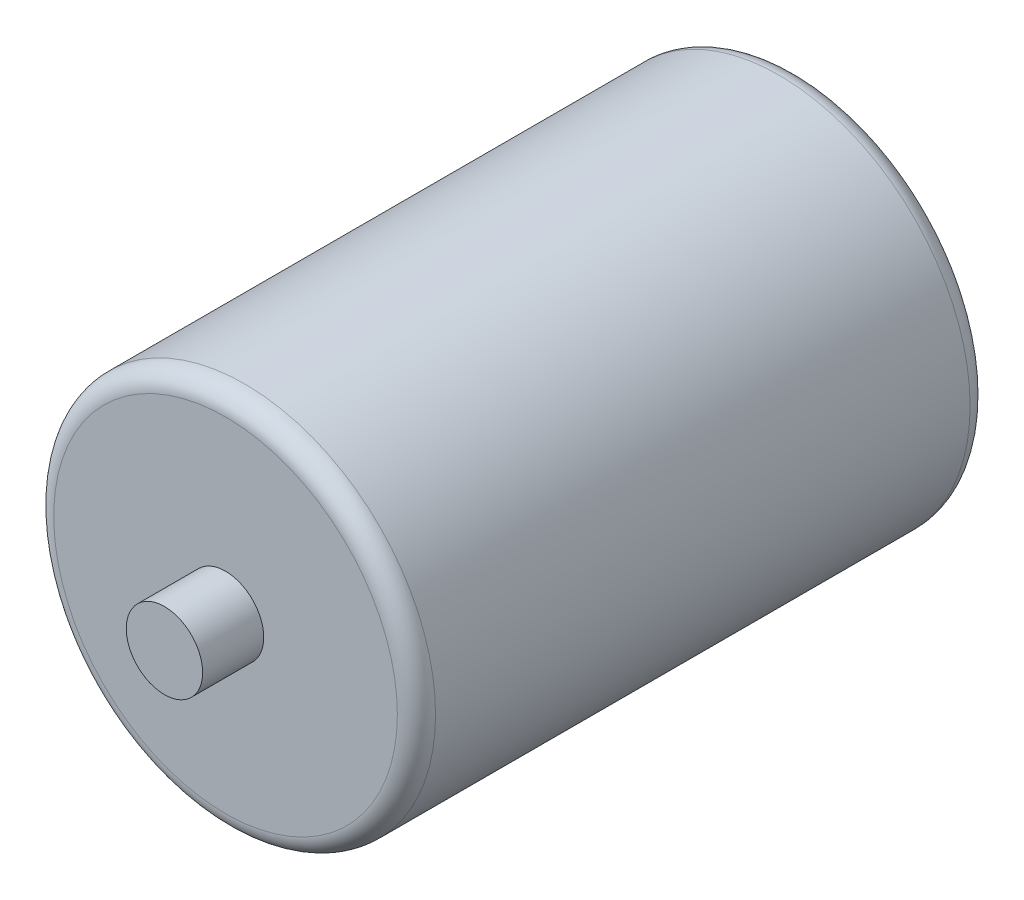
ISO-10303-21;
HEADER;
FILE_DESCRIPTION(('STEP AP214'),'2;1');
FILE_NAME('part.step','',(''),(''),'','','');
FILE_SCHEMA(('AUTOMOTIVE_DESIGN { 1 0 10303 214 1 1 1 1 }'));
ENDSEC;
DATA;
#1=APPLICATION_CONTEXT('core data for automotive mechanical design processes');
#2=APPLICATION_PROTOCOL_DEFINITION('international standard','automotive_design',2000,#1);
#3=PRODUCT_CONTEXT('',#1,'mechanical');
#4=PRODUCT('Part','Part','',(#3));
#5=PRODUCT_RELATED_PRODUCT_CATEGORY('part','',(#4));
#6=PRODUCT_DEFINITION_FORMATION('','',#4);
#7=PRODUCT_DEFINITION_CONTEXT('part definition',#1,'design');
#8=PRODUCT_DEFINITION('design','',#6,#7);
#9=PRODUCT_DEFINITION_SHAPE('','',#8);
#10=(LENGTH_UNIT() NAMED_UNIT(*) SI_UNIT(.MILLI.,.METRE.));
#11=(NAMED_UNIT(*) PLANE_ANGLE_UNIT() SI_UNIT($,.RADIAN.));
#12=(NAMED_UNIT(*) SI_UNIT($,.STERADIAN.) SOLID_ANGLE_UNIT());
#13=UNCERTAINTY_MEASURE_WITH_UNIT(LENGTH_MEASURE(1.E-05),#10,'distance_accuracy_value','');
#14=(GEOMETRIC_REPRESENTATION_CONTEXT(3) GLOBAL_UNCERTAINTY_ASSIGNED_CONTEXT((#13)) GLOBAL_UNIT_ASSIGNED_CONTEXT((#10,
#11,#12)) REPRESENTATION_CONTEXT('',''));
#15=CARTESIAN_POINT('',(0.,0.,0.));
#16=DIRECTION('',(0.,0.,1.));
#17=DIRECTION('',(1.,0.,0.));
#18=AXIS2_PLACEMENT_3D('',#15,#16,#17);
#19=CARTESIAN_POINT('',(0.,0.,3810.));
#20=DIRECTION('',(0.,0.,-1.));
#21=DIRECTION('',(-1.,0.,0.));
#22=AXIS2_PLACEMENT_3D('',#19,#20,#21);
#23=CYLINDRICAL_SURFACE('',#22,1270.);
#24=CARTESIAN_POINT('',(0.,0.,127.));
#25=DIRECTION('',(0.,0.,1.));
#26=DIRECTION('',(1.,0.,0.));
#27=AXIS2_PLACEMENT_3D('',#24,#25,#26);
#28=CIRCLE('',#27,1270.);
#29=CARTESIAN_POINT('',(1270.,0.,127.));
#30=VERTEX_POINT('',#29);
#31=EDGE_CURVE('E42',#30,#30,#28,.T.);
#32=ORIENTED_EDGE('',*,*,#31,.T.);
#33=EDGE_LOOP('',(#32));
#34=FACE_BOUND('',#33,.T.);
#35=CARTESIAN_POINT('',(0.,0.,3683.));
#36=DIRECTION('',(0.,0.,1.));
#37=DIRECTION('',(1.,0.,0.));
#38=AXIS2_PLACEMENT_3D('',#35,#36,#37);
#39=CIRCLE('',#38,1270.);
#40=CARTESIAN_POINT('',(1270.,0.,3683.));
#41=VERTEX_POINT('',#40);
#42=EDGE_CURVE('E46',#41,#41,#39,.F.);
#43=ORIENTED_EDGE('',*,*,#42,.T.);
#44=EDGE_LOOP('',(#43));
#45=FACE_BOUND('',#44,.T.);
#46=ADVANCED_FACE('F31',(#34,#45),#23,.T.);
#47=CARTESIAN_POINT('',(0.,0.,3810.));
#48=DIRECTION('',(0.,0.,1.));
#49=DIRECTION('',(1.,0.,0.));
#50=AXIS2_PLACEMENT_3D('',#47,#48,#49);
#51=PLANE('',#50);
#52=CARTESIAN_POINT('',(0.,0.,3810.));
#53=DIRECTION('',(0.,0.,1.));
#54=DIRECTION('',(1.,0.,0.));
#55=AXIS2_PLACEMENT_3D('',#52,#53,#54);
#56=CIRCLE('',#55,1143.);
#57=CARTESIAN_POINT('',(1143.,0.,3810.));
#58=VERTEX_POINT('',#57);
#59=EDGE_CURVE('E10',#58,#58,#56,.T.);
#60=ORIENTED_EDGE('',*,*,#59,.T.);
#61=EDGE_LOOP('',(#60));
#62=FACE_BOUND('',#61,.T.);
#63=CARTESIAN_POINT('',(0.,0.,3810.));
#64=DIRECTION('',(0.,0.,1.));
#65=DIRECTION('',(1.,0.,0.));
#66=AXIS2_PLACEMENT_3D('',#63,#64,#65);
#67=CIRCLE('',#66,254.);
#68=CARTESIAN_POINT('',(254.,0.,3810.));
#69=VERTEX_POINT('',#68);
#70=EDGE_CURVE('E52',#69,#69,#67,.T.);
#71=ORIENTED_EDGE('',*,*,#70,.F.);
#72=EDGE_LOOP('',(#71));
#73=FACE_BOUND('',#72,.T.);
#74=ADVANCED_FACE('F76',(#62,#73),#51,.T.);
#75=CARTESIAN_POINT('',(0.,0.,0.));
#76=DIRECTION('',(0.,0.,1.));
#77=DIRECTION('',(1.,0.,0.));
#78=AXIS2_PLACEMENT_3D('',#75,#76,#77);
#79=PLANE('',#78);
#80=CARTESIAN_POINT('',(0.,0.,0.));
#81=DIRECTION('',(0.,0.,1.));
#82=DIRECTION('',(1.,0.,0.));
#83=AXIS2_PLACEMENT_3D('',#80,#81,#82);
#84=CIRCLE('',#83,1143.);
#85=CARTESIAN_POINT('',(1143.,0.,0.));
#86=VERTEX_POINT('',#85);
#87=EDGE_CURVE('E38',#86,#86,#84,.F.);
#88=ORIENTED_EDGE('',*,*,#87,.T.);
#89=EDGE_LOOP('',(#88));
#90=FACE_BOUND('',#89,.T.);
#91=CARTESIAN_POINT('',(0.,0.,0.));
#92=DIRECTION('',(0.,0.,-1.));
#93=DIRECTION('',(-1.,0.,0.));
#94=AXIS2_PLACEMENT_3D('',#91,#92,#93);
#95=CIRCLE('',#94,254.);
#96=CARTESIAN_POINT('',(-254.,0.,0.));
#97=VERTEX_POINT('',#96);
#98=EDGE_CURVE('E51',#97,#97,#95,.T.);
#99=ORIENTED_EDGE('',*,*,#98,.F.);
#100=EDGE_LOOP('',(#99));
#101=FACE_BOUND('',#100,.T.);
#102=ADVANCED_FACE('F73',(#90,#101),#79,.F.);
#103=CARTESIAN_POINT('',(0.,0.,4216.4));
#104=DIRECTION('',(0.,0.,-1.));
#105=DIRECTION('',(-1.,0.,0.));
#106=AXIS2_PLACEMENT_3D('',#103,#104,#105);
#107=CYLINDRICAL_SURFACE('',#106,254.);
#108=CARTESIAN_POINT('',(0.,0.,4216.4));
#109=DIRECTION('',(0.,0.,1.));
#110=DIRECTION('',(1.,0.,0.));
#111=AXIS2_PLACEMENT_3D('',#108,#109,#110);
#112=CIRCLE('',#111,254.);
#113=CARTESIAN_POINT('',(254.,0.,4216.4));
#114=VERTEX_POINT('',#113);
#115=EDGE_CURVE('E55',#114,#114,#112,.T.);
#116=ORIENTED_EDGE('',*,*,#115,.F.);
#117=EDGE_LOOP('',(#116));
#118=FACE_BOUND('',#117,.T.);
#119=ORIENTED_EDGE('',*,*,#70,.T.);
#120=EDGE_LOOP('',(#119));
#121=FACE_BOUND('',#120,.T.);
#122=ADVANCED_FACE('F75',(#118,#121),#107,.T.);
#123=CARTESIAN_POINT('',(0.,0.,4216.4));
#124=DIRECTION('',(0.,0.,1.));
#125=DIRECTION('',(1.,0.,0.));
#126=AXIS2_PLACEMENT_3D('',#123,#124,#125);
#127=PLANE('',#126);
#128=ORIENTED_EDGE('',*,*,#115,.T.);
#129=EDGE_LOOP('',(#128));
#130=FACE_BOUND('',#129,.T.);
#131=ADVANCED_FACE('F69',(#130),#127,.T.);
#132=CARTESIAN_POINT('',(0.,0.,-406.4));
#133=DIRECTION('',(0.,0.,1.));
#134=DIRECTION('',(1.,0.,0.));
#135=AXIS2_PLACEMENT_3D('',#132,#133,#134);
#136=CYLINDRICAL_SURFACE('',#135,254.);
#137=CARTESIAN_POINT('',(0.,0.,-406.4));
#138=DIRECTION('',(0.,0.,-1.));
#139=DIRECTION('',(-1.,0.,0.));
#140=AXIS2_PLACEMENT_3D('',#137,#138,#139);
#141=CIRCLE('',#140,254.);
#142=CARTESIAN_POINT('',(-254.,0.,-406.4));
#143=VERTEX_POINT('',#142);
#144=EDGE_CURVE('E58',#143,#143,#141,.T.);
#145=ORIENTED_EDGE('',*,*,#144,.F.);
#146=EDGE_LOOP('',(#145));
#147=FACE_BOUND('',#146,.T.);
#148=ORIENTED_EDGE('',*,*,#98,.T.);
#149=EDGE_LOOP('',(#148));
#150=FACE_BOUND('',#149,.T.);
#151=ADVANCED_FACE('F66',(#147,#150),#136,.T.);
#152=CARTESIAN_POINT('',(0.,0.,-406.4));
#153=DIRECTION('',(0.,0.,-1.));
#154=DIRECTION('',(-1.,0.,0.));
#155=AXIS2_PLACEMENT_3D('',#152,#153,#154);
#156=PLANE('',#155);
#157=ORIENTED_EDGE('',*,*,#144,.T.);
#158=EDGE_LOOP('',(#157));
#159=FACE_BOUND('',#158,.T.);
#160=ADVANCED_FACE('F64',(#159),#156,.T.);
#161=CARTESIAN_POINT('',(0.,0.,127.));
#162=DIRECTION('',(0.,0.,1.));
#163=DIRECTION('',(1.,0.,0.));
#164=AXIS2_PLACEMENT_3D('',#161,#162,#163);
#165=TOROIDAL_SURFACE('',#164,1143.,127.);
#166=ORIENTED_EDGE('',*,*,#87,.F.);
#167=EDGE_LOOP('',(#166));
#168=FACE_BOUND('',#167,.T.);
#169=ORIENTED_EDGE('',*,*,#31,.F.);
#170=EDGE_LOOP('',(#169));
#171=FACE_BOUND('',#170,.T.);
#172=ADVANCED_FACE('F91',(#168,#171),#165,.T.);
#173=CARTESIAN_POINT('',(0.,0.,3683.));
#174=DIRECTION('',(0.,0.,1.));
#175=DIRECTION('',(1.,0.,0.));
#176=AXIS2_PLACEMENT_3D('',#173,#174,#175);
#177=TOROIDAL_SURFACE('',#176,1143.,127.);
#178=ORIENTED_EDGE('',*,*,#42,.F.);
#179=EDGE_LOOP('',(#178));
#180=FACE_BOUND('',#179,.T.);
#181=ORIENTED_EDGE('',*,*,#59,.F.);
#182=EDGE_LOOP('',(#181));
#183=FACE_BOUND('',#182,.T.);
#184=ADVANCED_FACE('F33',(#180,#183),#177,.T.);
#185=CLOSED_SHELL('',(#46,#74,#102,#122,#131,#151,#160,#172,#184));
#186=MANIFOLD_SOLID_BREP('B2',#185);
#187=ADVANCED_BREP_SHAPE_REPRESENTATION('',(#18,#186),#14);
#188=SHAPE_DEFINITION_REPRESENTATION(#9,#187);
ENDSEC;
END-ISO-10303-21;
